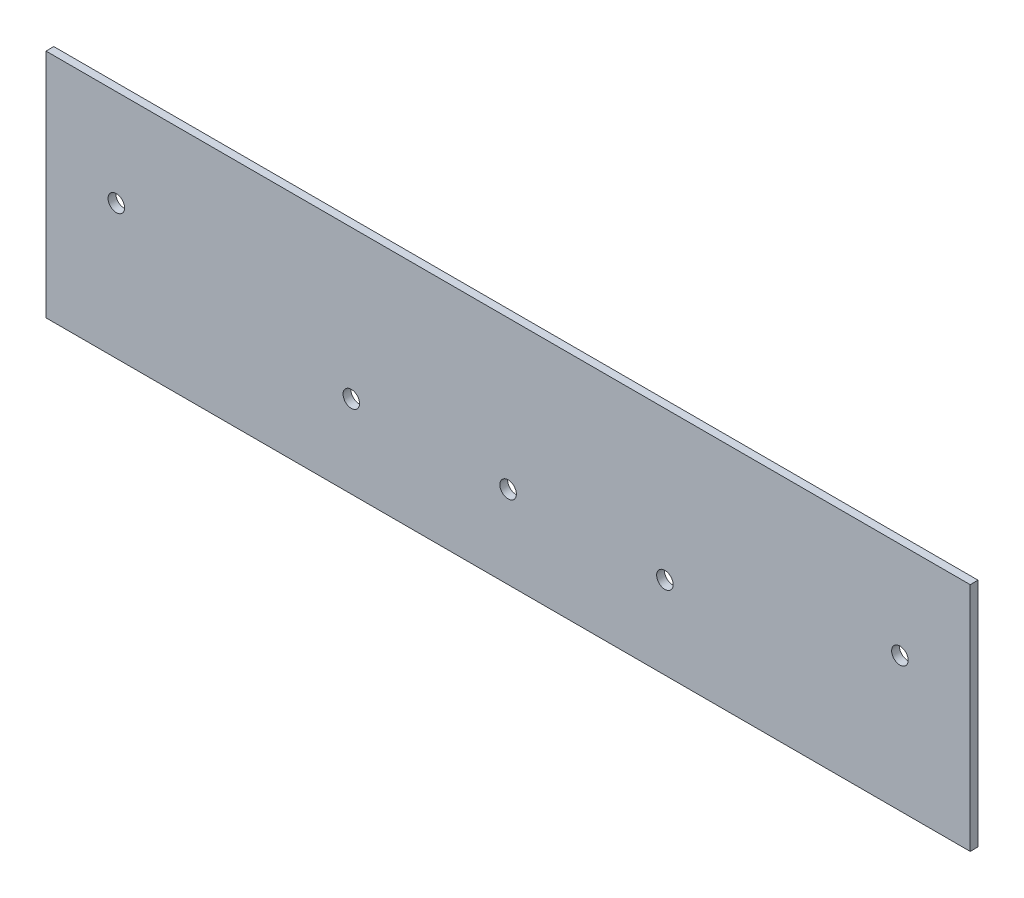
ISO-10303-21;
HEADER;
FILE_DESCRIPTION(('STEP AP214'),'2;1');
FILE_NAME('part.step','',(''),(''),'','','');
FILE_SCHEMA(('AUTOMOTIVE_DESIGN { 1 0 10303 214 1 1 1 1 }'));
ENDSEC;
DATA;
#1=APPLICATION_CONTEXT('core data for automotive mechanical design processes');
#2=APPLICATION_PROTOCOL_DEFINITION('international standard','automotive_design',2000,#1);
#3=PRODUCT_CONTEXT('',#1,'mechanical');
#4=PRODUCT('Part','Part','',(#3));
#5=PRODUCT_RELATED_PRODUCT_CATEGORY('part','',(#4));
#6=PRODUCT_DEFINITION_FORMATION('','',#4);
#7=PRODUCT_DEFINITION_CONTEXT('part definition',#1,'design');
#8=PRODUCT_DEFINITION('design','',#6,#7);
#9=PRODUCT_DEFINITION_SHAPE('','',#8);
#10=(LENGTH_UNIT() NAMED_UNIT(*) SI_UNIT(.MILLI.,.METRE.));
#11=(NAMED_UNIT(*) PLANE_ANGLE_UNIT() SI_UNIT($,.RADIAN.));
#12=(NAMED_UNIT(*) SI_UNIT($,.STERADIAN.) SOLID_ANGLE_UNIT());
#13=UNCERTAINTY_MEASURE_WITH_UNIT(LENGTH_MEASURE(1.E-05),#10,'distance_accuracy_value','');
#14=(GEOMETRIC_REPRESENTATION_CONTEXT(3) GLOBAL_UNCERTAINTY_ASSIGNED_CONTEXT((#13)) GLOBAL_UNIT_ASSIGNED_CONTEXT((#10,
#11,#12)) REPRESENTATION_CONTEXT('',''));
#15=CARTESIAN_POINT('',(0.,0.,0.));
#16=DIRECTION('',(0.,0.,1.));
#17=DIRECTION('',(1.,0.,0.));
#18=AXIS2_PLACEMENT_3D('',#15,#16,#17);
#19=CARTESIAN_POINT('',(-177.8,-57.15,3.));
#20=DIRECTION('',(1.,0.,0.));
#21=DIRECTION('',(0.,0.,-1.));
#22=AXIS2_PLACEMENT_3D('',#19,#20,#21);
#23=PLANE('',#22);
#24=DIRECTION('',(0.,0.,-1.));
#25=VECTOR('',#24,1.);
#26=CARTESIAN_POINT('',(-177.8,-31.75,3.001));
#27=LINE('',#26,#25);
#28=CARTESIAN_POINT('',(-177.8,-31.75,3.));
#29=VERTEX_POINT('',#28);
#30=CARTESIAN_POINT('',(-177.8,-31.75,0.));
#31=VERTEX_POINT('',#30);
#32=EDGE_CURVE('E57',#29,#31,#27,.T.);
#33=ORIENTED_EDGE('',*,*,#32,.F.);
#34=DIRECTION('',(0.,-1.,0.));
#35=VECTOR('',#34,1.);
#36=CARTESIAN_POINT('',(-177.8,-57.15,3.));
#37=LINE('',#36,#35);
#38=CARTESIAN_POINT('',(-177.8,57.15,3.));
#39=VERTEX_POINT('',#38);
#40=EDGE_CURVE('E88',#39,#29,#37,.T.);
#41=ORIENTED_EDGE('',*,*,#40,.F.);
#42=DIRECTION('',(0.,0.,-1.));
#43=VECTOR('',#42,1.);
#44=CARTESIAN_POINT('',(-177.8,57.15,3.));
#45=LINE('',#44,#43);
#46=CARTESIAN_POINT('',(-177.8,57.15,0.));
#47=VERTEX_POINT('',#46);
#48=EDGE_CURVE('E47',#39,#47,#45,.T.);
#49=ORIENTED_EDGE('',*,*,#48,.T.);
#50=DIRECTION('',(0.,-1.,0.));
#51=VECTOR('',#50,1.);
#52=CARTESIAN_POINT('',(-177.8,-57.15,0.));
#53=LINE('',#52,#51);
#54=EDGE_CURVE('E84',#47,#31,#53,.T.);
#55=ORIENTED_EDGE('',*,*,#54,.T.);
#56=EDGE_LOOP('',(#33,#41,#49,#55));
#57=FACE_BOUND('',#56,.T.);
#58=ADVANCED_FACE('F41',(#57),#23,.F.);
#59=CARTESIAN_POINT('',(0.,0.,3.));
#60=DIRECTION('',(0.,0.,-1.));
#61=DIRECTION('',(-1.,0.,0.));
#62=AXIS2_PLACEMENT_3D('',#59,#60,#61);
#63=PLANE('',#62);
#64=CARTESIAN_POINT('',(-60.325,0.,3.));
#65=DIRECTION('',(0.,0.,1.));
#66=DIRECTION('',(1.,0.,0.));
#67=AXIS2_PLACEMENT_3D('',#64,#65,#66);
#68=CIRCLE('',#67,3.175);
#69=CARTESIAN_POINT('',(-57.15,0.,3.));
#70=VERTEX_POINT('',#69);
#71=EDGE_CURVE('E104',#70,#70,#68,.T.);
#72=ORIENTED_EDGE('',*,*,#71,.F.);
#73=EDGE_LOOP('',(#72));
#74=FACE_BOUND('',#73,.T.);
#75=CARTESIAN_POINT('',(0.,0.,3.));
#76=DIRECTION('',(0.,0.,1.));
#77=DIRECTION('',(1.,0.,0.));
#78=AXIS2_PLACEMENT_3D('',#75,#76,#77);
#79=CIRCLE('',#78,3.17499999999997);
#80=CARTESIAN_POINT('',(3.17499999999997,0.,3.));
#81=VERTEX_POINT('',#80);
#82=EDGE_CURVE('E110',#81,#81,#79,.T.);
#83=ORIENTED_EDGE('',*,*,#82,.F.);
#84=EDGE_LOOP('',(#83));
#85=FACE_BOUND('',#84,.T.);
#86=CARTESIAN_POINT('',(-150.749,20.,3.));
#87=DIRECTION('',(0.,0.,1.));
#88=DIRECTION('',(1.,0.,0.));
#89=AXIS2_PLACEMENT_3D('',#86,#87,#88);
#90=CIRCLE('',#89,3.17500000000009);
#91=CARTESIAN_POINT('',(-147.574,20.,3.));
#92=VERTEX_POINT('',#91);
#93=EDGE_CURVE('E108',#92,#92,#90,.T.);
#94=ORIENTED_EDGE('',*,*,#93,.F.);
#95=EDGE_LOOP('',(#94));
#96=FACE_BOUND('',#95,.T.);
#97=CARTESIAN_POINT('',(60.325,0.,3.));
#98=DIRECTION('',(0.,0.,-1.));
#99=DIRECTION('',(-1.,0.,0.));
#100=AXIS2_PLACEMENT_3D('',#97,#98,#99);
#101=CIRCLE('',#100,3.175);
#102=CARTESIAN_POINT('',(57.15,0.,3.));
#103=VERTEX_POINT('',#102);
#104=EDGE_CURVE('E125',#103,#103,#101,.T.);
#105=ORIENTED_EDGE('',*,*,#104,.T.);
#106=EDGE_LOOP('',(#105));
#107=FACE_BOUND('',#106,.T.);
#108=CARTESIAN_POINT('',(150.749,20.,3.));
#109=DIRECTION('',(0.,0.,-1.));
#110=DIRECTION('',(-1.,0.,0.));
#111=AXIS2_PLACEMENT_3D('',#108,#109,#110);
#112=CIRCLE('',#111,3.17500000000009);
#113=CARTESIAN_POINT('',(147.574,20.,3.));
#114=VERTEX_POINT('',#113);
#115=EDGE_CURVE('E127',#114,#114,#112,.T.);
#116=ORIENTED_EDGE('',*,*,#115,.T.);
#117=EDGE_LOOP('',(#116));
#118=FACE_BOUND('',#117,.T.);
#119=DIRECTION('',(-1.,0.,0.));
#120=VECTOR('',#119,1.);
#121=CARTESIAN_POINT('',(177.8,-31.75,3.));
#122=LINE('',#121,#120);
#123=CARTESIAN_POINT('',(177.8,-31.75,3.));
#124=VERTEX_POINT('',#123);
#125=EDGE_CURVE('E136',#124,#29,#122,.T.);
#126=ORIENTED_EDGE('',*,*,#125,.F.);
#127=DIRECTION('',(0.,1.,0.));
#128=VECTOR('',#127,1.);
#129=CARTESIAN_POINT('',(177.8,-57.15,3.));
#130=LINE('',#129,#128);
#131=CARTESIAN_POINT('',(177.8,57.15,3.));
#132=VERTEX_POINT('',#131);
#133=EDGE_CURVE('E93',#124,#132,#130,.T.);
#134=ORIENTED_EDGE('',*,*,#133,.T.);
#135=DIRECTION('',(-1.,0.,0.));
#136=VECTOR('',#135,1.);
#137=CARTESIAN_POINT('',(-177.8,57.15,3.));
#138=LINE('',#137,#136);
#139=EDGE_CURVE('E64',#132,#39,#138,.T.);
#140=ORIENTED_EDGE('',*,*,#139,.T.);
#141=ORIENTED_EDGE('',*,*,#40,.T.);
#142=EDGE_LOOP('',(#126,#134,#140,#141));
#143=FACE_BOUND('',#142,.T.);
#144=ADVANCED_FACE('F144',(#74,#85,#96,#107,#118,#143),#63,.F.);
#145=CARTESIAN_POINT('',(177.8,-57.15,3.));
#146=DIRECTION('',(-1.,0.,0.));
#147=DIRECTION('',(0.,0.,1.));
#148=AXIS2_PLACEMENT_3D('',#145,#146,#147);
#149=PLANE('',#148);
#150=ORIENTED_EDGE('',*,*,#133,.F.);
#151=DIRECTION('',(0.,0.,-1.));
#152=VECTOR('',#151,1.);
#153=CARTESIAN_POINT('',(177.8,-31.75,3.001));
#154=LINE('',#153,#152);
#155=CARTESIAN_POINT('',(177.8,-31.75,0.));
#156=VERTEX_POINT('',#155);
#157=EDGE_CURVE('E132',#124,#156,#154,.T.);
#158=ORIENTED_EDGE('',*,*,#157,.T.);
#159=DIRECTION('',(0.,1.,0.));
#160=VECTOR('',#159,1.);
#161=CARTESIAN_POINT('',(177.8,-57.15,0.));
#162=LINE('',#161,#160);
#163=CARTESIAN_POINT('',(177.8,57.15,0.));
#164=VERTEX_POINT('',#163);
#165=EDGE_CURVE('E87',#156,#164,#162,.T.);
#166=ORIENTED_EDGE('',*,*,#165,.T.);
#167=DIRECTION('',(0.,0.,-1.));
#168=VECTOR('',#167,1.);
#169=CARTESIAN_POINT('',(177.8,57.15,3.));
#170=LINE('',#169,#168);
#171=EDGE_CURVE('E11',#132,#164,#170,.T.);
#172=ORIENTED_EDGE('',*,*,#171,.F.);
#173=EDGE_LOOP('',(#150,#158,#166,#172));
#174=FACE_BOUND('',#173,.T.);
#175=ADVANCED_FACE('F43',(#174),#149,.F.);
#176=CARTESIAN_POINT('',(-177.8,57.15,3.));
#177=DIRECTION('',(0.,-1.,0.));
#178=DIRECTION('',(0.,0.,-1.));
#179=AXIS2_PLACEMENT_3D('',#176,#177,#178);
#180=PLANE('',#179);
#181=DIRECTION('',(-1.,0.,0.));
#182=VECTOR('',#181,1.);
#183=CARTESIAN_POINT('',(-177.8,57.15,0.));
#184=LINE('',#183,#182);
#185=EDGE_CURVE('E80',#164,#47,#184,.T.);
#186=ORIENTED_EDGE('',*,*,#185,.T.);
#187=ORIENTED_EDGE('',*,*,#48,.F.);
#188=ORIENTED_EDGE('',*,*,#139,.F.);
#189=ORIENTED_EDGE('',*,*,#171,.T.);
#190=EDGE_LOOP('',(#186,#187,#188,#189));
#191=FACE_BOUND('',#190,.T.);
#192=ADVANCED_FACE('F79',(#191),#180,.F.);
#193=CARTESIAN_POINT('',(0.,0.,0.));
#194=DIRECTION('',(0.,0.,-1.));
#195=DIRECTION('',(-1.,0.,0.));
#196=AXIS2_PLACEMENT_3D('',#193,#194,#195);
#197=PLANE('',#196);
#198=DIRECTION('',(1.,0.,0.));
#199=VECTOR('',#198,1.);
#200=CARTESIAN_POINT('',(177.8,-31.75,0.));
#201=LINE('',#200,#199);
#202=EDGE_CURVE('E94',#31,#156,#201,.T.);
#203=ORIENTED_EDGE('',*,*,#202,.F.);
#204=ORIENTED_EDGE('',*,*,#54,.F.);
#205=ORIENTED_EDGE('',*,*,#185,.F.);
#206=ORIENTED_EDGE('',*,*,#165,.F.);
#207=EDGE_LOOP('',(#203,#204,#205,#206));
#208=FACE_BOUND('',#207,.T.);
#209=CARTESIAN_POINT('',(150.749,20.,0.));
#210=DIRECTION('',(0.,0.,-1.));
#211=DIRECTION('',(-1.,0.,0.));
#212=AXIS2_PLACEMENT_3D('',#209,#210,#211);
#213=CIRCLE('',#212,3.17500000000009);
#214=CARTESIAN_POINT('',(147.574,20.,0.));
#215=VERTEX_POINT('',#214);
#216=EDGE_CURVE('E123',#215,#215,#213,.T.);
#217=ORIENTED_EDGE('',*,*,#216,.F.);
#218=EDGE_LOOP('',(#217));
#219=FACE_BOUND('',#218,.T.);
#220=CARTESIAN_POINT('',(60.325,0.,0.));
#221=DIRECTION('',(0.,0.,-1.));
#222=DIRECTION('',(-1.,0.,0.));
#223=AXIS2_PLACEMENT_3D('',#220,#221,#222);
#224=CIRCLE('',#223,3.175);
#225=CARTESIAN_POINT('',(57.15,0.,0.));
#226=VERTEX_POINT('',#225);
#227=EDGE_CURVE('E114',#226,#226,#224,.T.);
#228=ORIENTED_EDGE('',*,*,#227,.F.);
#229=EDGE_LOOP('',(#228));
#230=FACE_BOUND('',#229,.T.);
#231=CARTESIAN_POINT('',(-150.749,20.,0.));
#232=DIRECTION('',(0.,0.,-1.));
#233=DIRECTION('',(-1.,0.,0.));
#234=AXIS2_PLACEMENT_3D('',#231,#232,#233);
#235=CIRCLE('',#234,3.17500000000009);
#236=CARTESIAN_POINT('',(-153.924,20.,0.));
#237=VERTEX_POINT('',#236);
#238=EDGE_CURVE('E115',#237,#237,#235,.F.);
#239=ORIENTED_EDGE('',*,*,#238,.T.);
#240=EDGE_LOOP('',(#239));
#241=FACE_BOUND('',#240,.T.);
#242=CARTESIAN_POINT('',(0.,0.,0.));
#243=DIRECTION('',(0.,0.,-1.));
#244=DIRECTION('',(-1.,0.,0.));
#245=AXIS2_PLACEMENT_3D('',#242,#243,#244);
#246=CIRCLE('',#245,3.17499999999997);
#247=CARTESIAN_POINT('',(-3.17499999999997,0.,0.));
#248=VERTEX_POINT('',#247);
#249=EDGE_CURVE('E111',#248,#248,#246,.F.);
#250=ORIENTED_EDGE('',*,*,#249,.T.);
#251=EDGE_LOOP('',(#250));
#252=FACE_BOUND('',#251,.T.);
#253=CARTESIAN_POINT('',(-60.325,0.,0.));
#254=DIRECTION('',(0.,0.,-1.));
#255=DIRECTION('',(-1.,0.,0.));
#256=AXIS2_PLACEMENT_3D('',#253,#254,#255);
#257=CIRCLE('',#256,3.175);
#258=CARTESIAN_POINT('',(-63.5,0.,0.));
#259=VERTEX_POINT('',#258);
#260=EDGE_CURVE('E100',#259,#259,#257,.F.);
#261=ORIENTED_EDGE('',*,*,#260,.T.);
#262=EDGE_LOOP('',(#261));
#263=FACE_BOUND('',#262,.T.);
#264=ADVANCED_FACE('F91',(#208,#219,#230,#241,#252,#263),#197,.T.);
#265=CARTESIAN_POINT('',(-60.325,0.,-8.98025612106941));
#266=DIRECTION('',(0.,0.,1.));
#267=DIRECTION('',(1.,0.,0.));
#268=AXIS2_PLACEMENT_3D('',#265,#266,#267);
#269=CYLINDRICAL_SURFACE('',#268,3.175);
#270=ORIENTED_EDGE('',*,*,#71,.T.);
#271=EDGE_LOOP('',(#270));
#272=FACE_BOUND('',#271,.T.);
#273=ORIENTED_EDGE('',*,*,#260,.F.);
#274=EDGE_LOOP('',(#273));
#275=FACE_BOUND('',#274,.T.);
#276=ADVANCED_FACE('F159',(#272,#275),#269,.F.);
#277=CARTESIAN_POINT('',(0.,0.,-8.98025612106941));
#278=DIRECTION('',(0.,0.,1.));
#279=DIRECTION('',(1.,0.,0.));
#280=AXIS2_PLACEMENT_3D('',#277,#278,#279);
#281=CYLINDRICAL_SURFACE('',#280,3.17499999999997);
#282=ORIENTED_EDGE('',*,*,#82,.T.);
#283=EDGE_LOOP('',(#282));
#284=FACE_BOUND('',#283,.T.);
#285=ORIENTED_EDGE('',*,*,#249,.F.);
#286=EDGE_LOOP('',(#285));
#287=FACE_BOUND('',#286,.T.);
#288=ADVANCED_FACE('F173',(#284,#287),#281,.F.);
#289=CARTESIAN_POINT('',(-150.749,20.,-8.98025612106941));
#290=DIRECTION('',(0.,0.,1.));
#291=DIRECTION('',(1.,0.,0.));
#292=AXIS2_PLACEMENT_3D('',#289,#290,#291);
#293=CYLINDRICAL_SURFACE('',#292,3.17500000000009);
#294=ORIENTED_EDGE('',*,*,#93,.T.);
#295=EDGE_LOOP('',(#294));
#296=FACE_BOUND('',#295,.T.);
#297=ORIENTED_EDGE('',*,*,#238,.F.);
#298=EDGE_LOOP('',(#297));
#299=FACE_BOUND('',#298,.T.);
#300=ADVANCED_FACE('F181',(#296,#299),#293,.F.);
#301=CARTESIAN_POINT('',(60.325,0.,-8.98025612106941));
#302=DIRECTION('',(0.,0.,1.));
#303=DIRECTION('',(1.,0.,0.));
#304=AXIS2_PLACEMENT_3D('',#301,#302,#303);
#305=CYLINDRICAL_SURFACE('',#304,3.175);
#306=ORIENTED_EDGE('',*,*,#104,.F.);
#307=EDGE_LOOP('',(#306));
#308=FACE_BOUND('',#307,.T.);
#309=ORIENTED_EDGE('',*,*,#227,.T.);
#310=EDGE_LOOP('',(#309));
#311=FACE_BOUND('',#310,.T.);
#312=ADVANCED_FACE('F188',(#308,#311),#305,.F.);
#313=CARTESIAN_POINT('',(150.749,20.,-8.98025612106941));
#314=DIRECTION('',(0.,0.,1.));
#315=DIRECTION('',(1.,0.,0.));
#316=AXIS2_PLACEMENT_3D('',#313,#314,#315);
#317=CYLINDRICAL_SURFACE('',#316,3.17500000000009);
#318=ORIENTED_EDGE('',*,*,#115,.F.);
#319=EDGE_LOOP('',(#318));
#320=FACE_BOUND('',#319,.T.);
#321=ORIENTED_EDGE('',*,*,#216,.T.);
#322=EDGE_LOOP('',(#321));
#323=FACE_BOUND('',#322,.T.);
#324=ADVANCED_FACE('F199',(#320,#323),#317,.F.);
#325=CARTESIAN_POINT('',(177.8,-31.75,3.001));
#326=DIRECTION('',(0.,1.,0.));
#327=DIRECTION('',(-1.,0.,0.));
#328=AXIS2_PLACEMENT_3D('',#325,#326,#327);
#329=PLANE('',#328);
#330=ORIENTED_EDGE('',*,*,#125,.T.);
#331=ORIENTED_EDGE('',*,*,#32,.T.);
#332=ORIENTED_EDGE('',*,*,#202,.T.);
#333=ORIENTED_EDGE('',*,*,#157,.F.);
#334=EDGE_LOOP('',(#330,#331,#332,#333));
#335=FACE_BOUND('',#334,.T.);
#336=ADVANCED_FACE('F140',(#335),#329,.F.);
#337=CLOSED_SHELL('',(#58,#144,#175,#192,#264,#276,#288,#300,#312,#324,#336));
#338=MANIFOLD_SOLID_BREP('B2',#337);
#339=ADVANCED_BREP_SHAPE_REPRESENTATION('',(#18,#338),#14);
#340=SHAPE_DEFINITION_REPRESENTATION(#9,#339);
ENDSEC;
END-ISO-10303-21;
